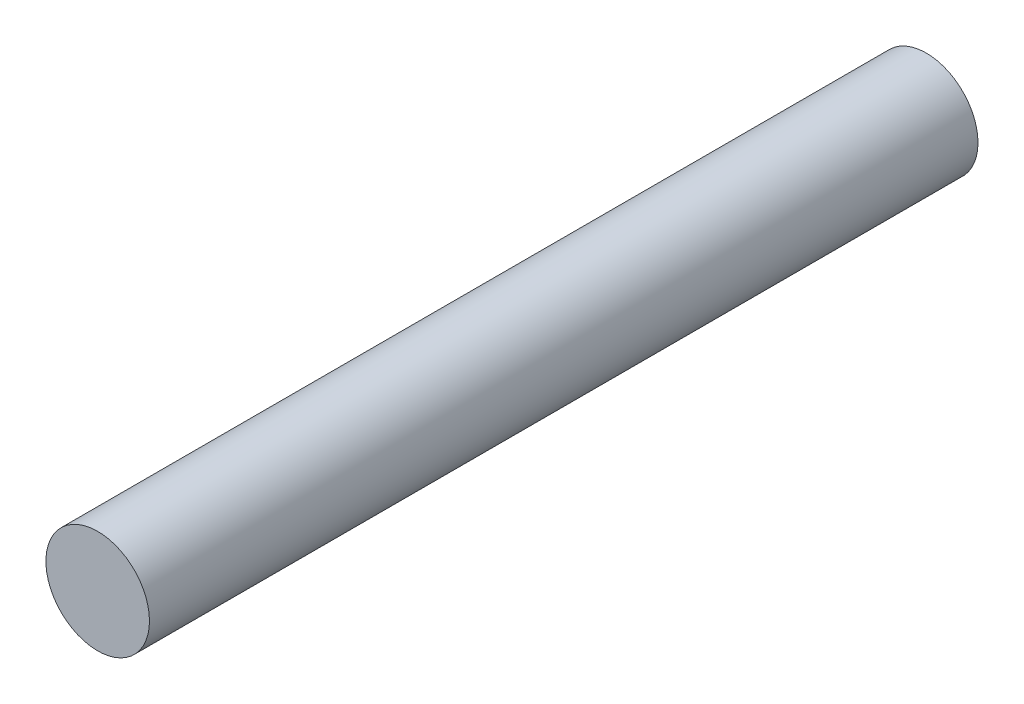
ISO-10303-21;
HEADER;
FILE_DESCRIPTION(('STEP AP214'),'2;1');
FILE_NAME('part.step','',(''),(''),'','','');
FILE_SCHEMA(('AUTOMOTIVE_DESIGN { 1 0 10303 214 1 1 1 1 }'));
ENDSEC;
DATA;
#1=APPLICATION_CONTEXT('core data for automotive mechanical design processes');
#2=APPLICATION_PROTOCOL_DEFINITION('international standard','automotive_design',2000,#1);
#3=PRODUCT_CONTEXT('',#1,'mechanical');
#4=PRODUCT('Part','Part','',(#3));
#5=PRODUCT_RELATED_PRODUCT_CATEGORY('part','',(#4));
#6=PRODUCT_DEFINITION_FORMATION('','',#4);
#7=PRODUCT_DEFINITION_CONTEXT('part definition',#1,'design');
#8=PRODUCT_DEFINITION('design','',#6,#7);
#9=PRODUCT_DEFINITION_SHAPE('','',#8);
#10=(LENGTH_UNIT() NAMED_UNIT(*) SI_UNIT(.MILLI.,.METRE.));
#11=(NAMED_UNIT(*) PLANE_ANGLE_UNIT() SI_UNIT($,.RADIAN.));
#12=(NAMED_UNIT(*) SI_UNIT($,.STERADIAN.) SOLID_ANGLE_UNIT());
#13=UNCERTAINTY_MEASURE_WITH_UNIT(LENGTH_MEASURE(1.E-05),#10,'distance_accuracy_value','');
#14=(GEOMETRIC_REPRESENTATION_CONTEXT(3) GLOBAL_UNCERTAINTY_ASSIGNED_CONTEXT((#13)) GLOBAL_UNIT_ASSIGNED_CONTEXT((#10,
#11,#12)) REPRESENTATION_CONTEXT('',''));
#15=CARTESIAN_POINT('',(0.,0.,0.));
#16=DIRECTION('',(0.,0.,1.));
#17=DIRECTION('',(1.,0.,0.));
#18=AXIS2_PLACEMENT_3D('',#15,#16,#17);
#19=CARTESIAN_POINT('',(0.,0.,40.));
#20=DIRECTION('',(0.,0.,-1.));
#21=DIRECTION('',(-1.,0.,0.));
#22=AXIS2_PLACEMENT_3D('',#19,#20,#21);
#23=CYLINDRICAL_SURFACE('',#22,2.5);
#24=CARTESIAN_POINT('',(0.,0.,40.));
#25=DIRECTION('',(0.,0.,1.));
#26=DIRECTION('',(1.,0.,0.));
#27=AXIS2_PLACEMENT_3D('',#24,#25,#26);
#28=CIRCLE('',#27,2.5);
#29=CARTESIAN_POINT('',(2.5,0.,40.));
#30=VERTEX_POINT('',#29);
#31=EDGE_CURVE('E10',#30,#30,#28,.T.);
#32=ORIENTED_EDGE('',*,*,#31,.F.);
#33=EDGE_LOOP('',(#32));
#34=FACE_BOUND('',#33,.T.);
#35=CARTESIAN_POINT('',(0.,0.,0.));
#36=DIRECTION('',(0.,0.,1.));
#37=DIRECTION('',(1.,0.,0.));
#38=AXIS2_PLACEMENT_3D('',#35,#36,#37);
#39=CIRCLE('',#38,2.5);
#40=CARTESIAN_POINT('',(2.5,0.,0.));
#41=VERTEX_POINT('',#40);
#42=EDGE_CURVE('E46',#41,#41,#39,.T.);
#43=ORIENTED_EDGE('',*,*,#42,.T.);
#44=EDGE_LOOP('',(#43));
#45=FACE_BOUND('',#44,.T.);
#46=ADVANCED_FACE('F43',(#34,#45),#23,.T.);
#47=CARTESIAN_POINT('',(0.,0.,40.));
#48=DIRECTION('',(0.,0.,1.));
#49=DIRECTION('',(1.,0.,0.));
#50=AXIS2_PLACEMENT_3D('',#47,#48,#49);
#51=PLANE('',#50);
#52=ORIENTED_EDGE('',*,*,#31,.T.);
#53=EDGE_LOOP('',(#52));
#54=FACE_BOUND('',#53,.T.);
#55=ADVANCED_FACE('F58',(#54),#51,.T.);
#56=CARTESIAN_POINT('',(0.,0.,0.));
#57=DIRECTION('',(0.,0.,1.));
#58=DIRECTION('',(1.,0.,0.));
#59=AXIS2_PLACEMENT_3D('',#56,#57,#58);
#60=PLANE('',#59);
#61=ORIENTED_EDGE('',*,*,#42,.F.);
#62=EDGE_LOOP('',(#61));
#63=FACE_BOUND('',#62,.T.);
#64=ADVANCED_FACE('F59',(#63),#60,.F.);
#65=CLOSED_SHELL('',(#46,#55,#64));
#66=MANIFOLD_SOLID_BREP('B2',#65);
#67=ADVANCED_BREP_SHAPE_REPRESENTATION('',(#18,#66),#14);
#68=SHAPE_DEFINITION_REPRESENTATION(#9,#67);
ENDSEC;
END-ISO-10303-21;
